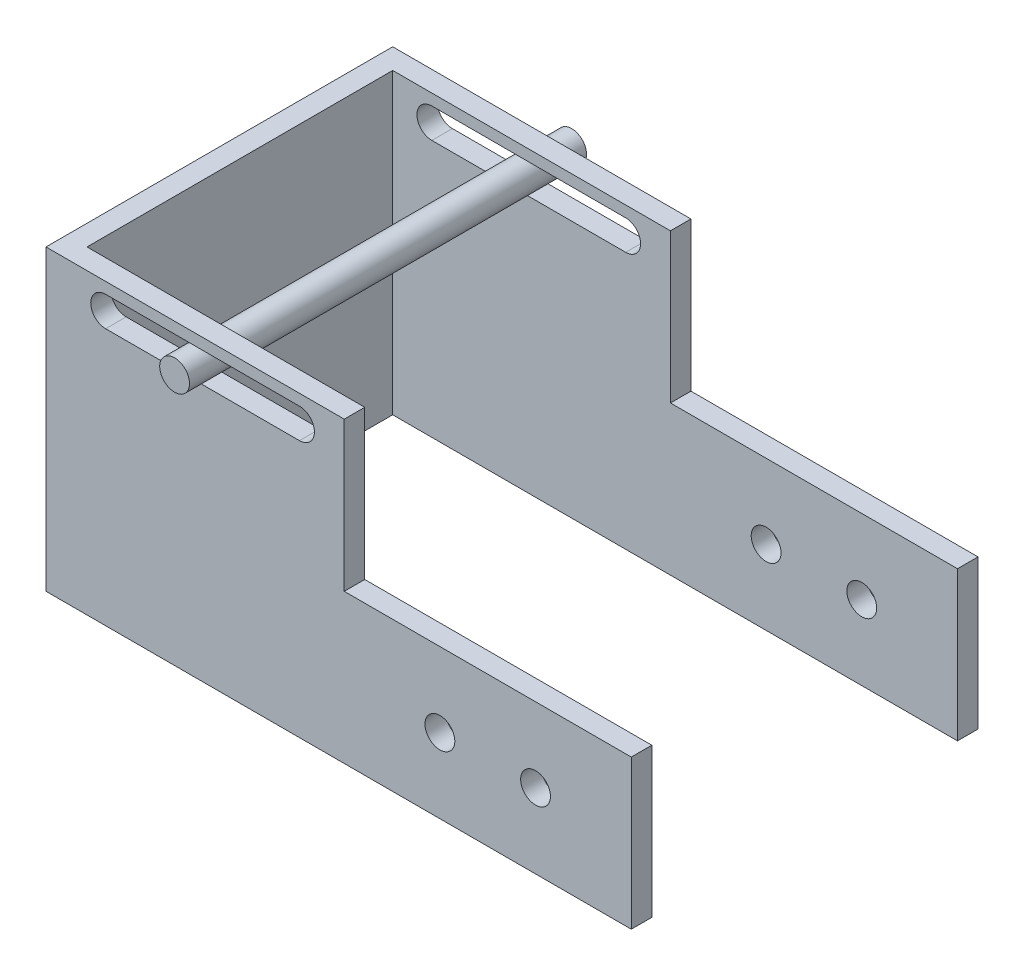
ISO-10303-21;
HEADER;
FILE_DESCRIPTION(('STEP AP214'),'2;1');
FILE_NAME('part.step','',(''),(''),'','','');
FILE_SCHEMA(('AUTOMOTIVE_DESIGN { 1 0 10303 214 1 1 1 1 }'));
ENDSEC;
DATA;
#1=APPLICATION_CONTEXT('core data for automotive mechanical design processes');
#2=APPLICATION_PROTOCOL_DEFINITION('international standard','automotive_design',2000,#1);
#3=PRODUCT_CONTEXT('',#1,'mechanical');
#4=PRODUCT('Part','Part','',(#3));
#5=PRODUCT_RELATED_PRODUCT_CATEGORY('part','',(#4));
#6=PRODUCT_DEFINITION_FORMATION('','',#4);
#7=PRODUCT_DEFINITION_CONTEXT('part definition',#1,'design');
#8=PRODUCT_DEFINITION('design','',#6,#7);
#9=PRODUCT_DEFINITION_SHAPE('','',#8);
#10=(LENGTH_UNIT() NAMED_UNIT(*) SI_UNIT(.MILLI.,.METRE.));
#11=(NAMED_UNIT(*) PLANE_ANGLE_UNIT() SI_UNIT($,.RADIAN.));
#12=(NAMED_UNIT(*) SI_UNIT($,.STERADIAN.) SOLID_ANGLE_UNIT());
#13=UNCERTAINTY_MEASURE_WITH_UNIT(LENGTH_MEASURE(1.E-05),#10,'distance_accuracy_value','');
#14=(GEOMETRIC_REPRESENTATION_CONTEXT(3) GLOBAL_UNCERTAINTY_ASSIGNED_CONTEXT((#13)) GLOBAL_UNIT_ASSIGNED_CONTEXT((#10,
#11,#12)) REPRESENTATION_CONTEXT('',''));
#15=CARTESIAN_POINT('',(0.,0.,0.));
#16=DIRECTION('',(0.,0.,1.));
#17=DIRECTION('',(1.,0.,0.));
#18=AXIS2_PLACEMENT_3D('',#15,#16,#17);
#19=CARTESIAN_POINT('',(-20.,16.5,49.25));
#20=DIRECTION('',(0.,0.,-1.));
#21=DIRECTION('',(-1.,0.,0.));
#22=AXIS2_PLACEMENT_3D('',#19,#20,#21);
#23=CYLINDRICAL_SURFACE('',#22,2.);
#24=CARTESIAN_POINT('',(-20.,16.5,49.25));
#25=DIRECTION('',(0.,0.,1.));
#26=DIRECTION('',(1.,0.,0.));
#27=AXIS2_PLACEMENT_3D('',#24,#25,#26);
#28=CIRCLE('',#27,2.);
#29=CARTESIAN_POINT('',(-18.,16.5,49.25));
#30=VERTEX_POINT('',#29);
#31=EDGE_CURVE('E11',#30,#30,#28,.T.);
#32=ORIENTED_EDGE('',*,*,#31,.F.);
#33=EDGE_LOOP('',(#32));
#34=FACE_BOUND('',#33,.T.);
#35=CARTESIAN_POINT('',(-20.,16.5,-4.));
#36=DIRECTION('',(0.,0.,1.));
#37=DIRECTION('',(1.,0.,0.));
#38=AXIS2_PLACEMENT_3D('',#35,#36,#37);
#39=CIRCLE('',#38,2.);
#40=CARTESIAN_POINT('',(-18.,16.5,-4.));
#41=VERTEX_POINT('',#40);
#42=EDGE_CURVE('E56',#41,#41,#39,.T.);
#43=ORIENTED_EDGE('',*,*,#42,.T.);
#44=EDGE_LOOP('',(#43));
#45=FACE_BOUND('',#44,.T.);
#46=ADVANCED_FACE('F53',(#34,#45),#23,.T.);
#47=CARTESIAN_POINT('',(-20.,16.5,49.25));
#48=DIRECTION('',(0.,0.,1.));
#49=DIRECTION('',(1.,0.,0.));
#50=AXIS2_PLACEMENT_3D('',#47,#48,#49);
#51=PLANE('',#50);
#52=ORIENTED_EDGE('',*,*,#31,.T.);
#53=EDGE_LOOP('',(#52));
#54=FACE_BOUND('',#53,.T.);
#55=ADVANCED_FACE('F68',(#54),#51,.T.);
#56=CARTESIAN_POINT('',(-20.,16.5,-4.));
#57=DIRECTION('',(0.,0.,1.));
#58=DIRECTION('',(1.,0.,0.));
#59=AXIS2_PLACEMENT_3D('',#56,#57,#58);
#60=PLANE('',#59);
#61=ORIENTED_EDGE('',*,*,#42,.F.);
#62=EDGE_LOOP('',(#61));
#63=FACE_BOUND('',#62,.T.);
#64=ADVANCED_FACE('F66',(#63),#60,.F.);
#65=CLOSED_SHELL('',(#46,#55,#64));
#66=MANIFOLD_SOLID_BREP('B2',#65);
#67=CARTESIAN_POINT('',(-37.25,20.,46.5));
#68=DIRECTION('',(-1.,0.,0.));
#69=DIRECTION('',(0.,-1.,0.));
#70=AXIS2_PLACEMENT_3D('',#67,#68,#69);
#71=PLANE('',#70);
#72=DIRECTION('',(0.,1.,0.));
#73=VECTOR('',#72,1.);
#74=CARTESIAN_POINT('',(-37.25,20.,43.75));
#75=LINE('',#74,#73);
#76=CARTESIAN_POINT('',(-37.25,-20.,43.75));
#77=VERTEX_POINT('',#76);
#78=CARTESIAN_POINT('',(-37.25,20.,43.75));
#79=VERTEX_POINT('',#78);
#80=EDGE_CURVE('E51',#77,#79,#75,.T.);
#81=ORIENTED_EDGE('',*,*,#80,.F.);
#82=DIRECTION('',(0.,0.,-1.));
#83=VECTOR('',#82,1.);
#84=CARTESIAN_POINT('',(-37.25,-20.,46.5));
#85=LINE('',#84,#83);
#86=CARTESIAN_POINT('',(-37.25,-20.,2.75));
#87=VERTEX_POINT('',#86);
#88=EDGE_CURVE('E118',#77,#87,#85,.T.);
#89=ORIENTED_EDGE('',*,*,#88,.T.);
#90=DIRECTION('',(0.,1.,0.));
#91=VECTOR('',#90,1.);
#92=CARTESIAN_POINT('',(-37.25,20.,2.75));
#93=LINE('',#92,#91);
#94=CARTESIAN_POINT('',(-37.25,20.,2.75));
#95=VERTEX_POINT('',#94);
#96=EDGE_CURVE('E340',#87,#95,#93,.T.);
#97=ORIENTED_EDGE('',*,*,#96,.T.);
#98=DIRECTION('',(0.,0.,-1.));
#99=VECTOR('',#98,1.);
#100=CARTESIAN_POINT('',(-37.25,20.,46.5));
#101=LINE('',#100,#99);
#102=EDGE_CURVE('E359',#79,#95,#101,.T.);
#103=ORIENTED_EDGE('',*,*,#102,.F.);
#104=EDGE_LOOP('',(#81,#89,#97,#103));
#105=FACE_BOUND('',#104,.T.);
#106=ADVANCED_FACE('F100',(#105),#71,.F.);
#107=CARTESIAN_POINT('',(0.,0.,2.75));
#108=DIRECTION('',(0.,1.,0.));
#109=DIRECTION('',(0.,0.,1.));
#110=AXIS2_PLACEMENT_3D('',#107,#108,#109);
#111=PLANE('',#110);
#112=DIRECTION('',(1.,0.,0.));
#113=VECTOR('',#112,1.);
#114=CARTESIAN_POINT('',(0.,0.,0.));
#115=LINE('',#114,#113);
#116=CARTESIAN_POINT('',(0.,0.,0.));
#117=VERTEX_POINT('',#116);
#118=CARTESIAN_POINT('',(38.5,0.,0.));
#119=VERTEX_POINT('',#118);
#120=EDGE_CURVE('E430',#117,#119,#115,.T.);
#121=ORIENTED_EDGE('',*,*,#120,.F.);
#122=DIRECTION('',(0.,0.,-1.));
#123=VECTOR('',#122,1.);
#124=CARTESIAN_POINT('',(0.,0.,2.75));
#125=LINE('',#124,#123);
#126=CARTESIAN_POINT('',(0.,0.,2.75));
#127=VERTEX_POINT('',#126);
#128=EDGE_CURVE('E109',#127,#117,#125,.T.);
#129=ORIENTED_EDGE('',*,*,#128,.F.);
#130=DIRECTION('',(1.,0.,0.));
#131=VECTOR('',#130,1.);
#132=CARTESIAN_POINT('',(0.,0.,2.75));
#133=LINE('',#132,#131);
#134=CARTESIAN_POINT('',(38.5,0.,2.75));
#135=VERTEX_POINT('',#134);
#136=EDGE_CURVE('E390',#127,#135,#133,.T.);
#137=ORIENTED_EDGE('',*,*,#136,.T.);
#138=DIRECTION('',(0.,0.,-1.));
#139=VECTOR('',#138,1.);
#140=CARTESIAN_POINT('',(38.5,0.,2.75));
#141=LINE('',#140,#139);
#142=EDGE_CURVE('E453',#135,#119,#141,.T.);
#143=ORIENTED_EDGE('',*,*,#142,.T.);
#144=EDGE_LOOP('',(#121,#129,#137,#143));
#145=FACE_BOUND('',#144,.T.);
#146=ADVANCED_FACE('F526',(#145),#111,.T.);
#147=CARTESIAN_POINT('',(0.,0.,2.75));
#148=DIRECTION('',(-1.,0.,0.));
#149=DIRECTION('',(0.,-1.,0.));
#150=AXIS2_PLACEMENT_3D('',#147,#148,#149);
#151=PLANE('',#150);
#152=DIRECTION('',(0.,1.,0.));
#153=VECTOR('',#152,1.);
#154=CARTESIAN_POINT('',(0.,0.,0.));
#155=LINE('',#154,#153);
#156=CARTESIAN_POINT('',(0.,20.,0.));
#157=VERTEX_POINT('',#156);
#158=EDGE_CURVE('E434',#117,#157,#155,.T.);
#159=ORIENTED_EDGE('',*,*,#158,.T.);
#160=DIRECTION('',(0.,0.,-1.));
#161=VECTOR('',#160,1.);
#162=CARTESIAN_POINT('',(0.,20.,2.75));
#163=LINE('',#162,#161);
#164=CARTESIAN_POINT('',(0.,20.,2.75));
#165=VERTEX_POINT('',#164);
#166=EDGE_CURVE('E467',#165,#157,#163,.T.);
#167=ORIENTED_EDGE('',*,*,#166,.F.);
#168=DIRECTION('',(0.,1.,0.));
#169=VECTOR('',#168,1.);
#170=CARTESIAN_POINT('',(0.,0.,2.75));
#171=LINE('',#170,#169);
#172=EDGE_CURVE('E394',#127,#165,#171,.T.);
#173=ORIENTED_EDGE('',*,*,#172,.F.);
#174=ORIENTED_EDGE('',*,*,#128,.T.);
#175=EDGE_LOOP('',(#159,#167,#173,#174));
#176=FACE_BOUND('',#175,.T.);
#177=ADVANCED_FACE('F548',(#176),#151,.F.);
#178=CARTESIAN_POINT('',(0.,20.,2.75));
#179=DIRECTION('',(0.,1.,0.));
#180=DIRECTION('',(0.,0.,1.));
#181=AXIS2_PLACEMENT_3D('',#178,#179,#180);
#182=PLANE('',#181);
#183=DIRECTION('',(1.,0.,0.));
#184=VECTOR('',#183,1.);
#185=CARTESIAN_POINT('',(0.,20.,43.75));
#186=LINE('',#185,#184);
#187=CARTESIAN_POINT('',(0.,20.,43.75));
#188=VERTEX_POINT('',#187);
#189=EDGE_CURVE('E322',#79,#188,#186,.T.);
#190=ORIENTED_EDGE('',*,*,#189,.F.);
#191=ORIENTED_EDGE('',*,*,#102,.T.);
#192=DIRECTION('',(1.,0.,0.));
#193=VECTOR('',#192,1.);
#194=CARTESIAN_POINT('',(0.,20.,2.75));
#195=LINE('',#194,#193);
#196=EDGE_CURVE('E398',#95,#165,#195,.T.);
#197=ORIENTED_EDGE('',*,*,#196,.T.);
#198=ORIENTED_EDGE('',*,*,#166,.T.);
#199=DIRECTION('',(1.,0.,0.));
#200=VECTOR('',#199,1.);
#201=CARTESIAN_POINT('',(0.,20.,0.));
#202=LINE('',#201,#200);
#203=CARTESIAN_POINT('',(-40.,20.,0.));
#204=VERTEX_POINT('',#203);
#205=EDGE_CURVE('E438',#204,#157,#202,.T.);
#206=ORIENTED_EDGE('',*,*,#205,.F.);
#207=DIRECTION('',(0.,0.,-1.));
#208=VECTOR('',#207,1.);
#209=CARTESIAN_POINT('',(-40.,20.,2.75));
#210=LINE('',#209,#208);
#211=CARTESIAN_POINT('',(-40.,20.,46.5));
#212=VERTEX_POINT('',#211);
#213=EDGE_CURVE('E464',#212,#204,#210,.T.);
#214=ORIENTED_EDGE('',*,*,#213,.F.);
#215=DIRECTION('',(-1.,0.,0.));
#216=VECTOR('',#215,1.);
#217=CARTESIAN_POINT('',(-40.,20.,46.5));
#218=LINE('',#217,#216);
#219=CARTESIAN_POINT('',(0.,20.,46.5));
#220=VERTEX_POINT('',#219);
#221=EDGE_CURVE('E355',#220,#212,#218,.T.);
#222=ORIENTED_EDGE('',*,*,#221,.F.);
#223=DIRECTION('',(0.,0.,-1.));
#224=VECTOR('',#223,1.);
#225=CARTESIAN_POINT('',(0.,20.,46.5));
#226=LINE('',#225,#224);
#227=EDGE_CURVE('E333',#220,#188,#226,.T.);
#228=ORIENTED_EDGE('',*,*,#227,.T.);
#229=EDGE_LOOP('',(#190,#191,#197,#198,#206,#214,#222,#228));
#230=FACE_BOUND('',#229,.T.);
#231=ADVANCED_FACE('F544',(#230),#182,.T.);
#232=CARTESIAN_POINT('',(-40.,0.,2.75));
#233=DIRECTION('',(-1.,0.,0.));
#234=DIRECTION('',(0.,0.,1.));
#235=AXIS2_PLACEMENT_3D('',#232,#233,#234);
#236=PLANE('',#235);
#237=ORIENTED_EDGE('',*,*,#213,.T.);
#238=DIRECTION('',(0.,1.,0.));
#239=VECTOR('',#238,1.);
#240=CARTESIAN_POINT('',(-40.,0.,0.));
#241=LINE('',#240,#239);
#242=CARTESIAN_POINT('',(-40.,-20.,0.));
#243=VERTEX_POINT('',#242);
#244=EDGE_CURVE('E442',#243,#204,#241,.T.);
#245=ORIENTED_EDGE('',*,*,#244,.F.);
#246=DIRECTION('',(0.,0.,-1.));
#247=VECTOR('',#246,1.);
#248=CARTESIAN_POINT('',(-40.,-20.,2.75));
#249=LINE('',#248,#247);
#250=CARTESIAN_POINT('',(-40.,-20.,46.5));
#251=VERTEX_POINT('',#250);
#252=EDGE_CURVE('E461',#251,#243,#249,.T.);
#253=ORIENTED_EDGE('',*,*,#252,.F.);
#254=DIRECTION('',(0.,-1.,0.));
#255=VECTOR('',#254,1.);
#256=CARTESIAN_POINT('',(-40.,20.,46.5));
#257=LINE('',#256,#255);
#258=EDGE_CURVE('E348',#212,#251,#257,.T.);
#259=ORIENTED_EDGE('',*,*,#258,.F.);
#260=EDGE_LOOP('',(#237,#245,#253,#259));
#261=FACE_BOUND('',#260,.T.);
#262=ADVANCED_FACE('F539',(#261),#236,.T.);
#263=CARTESIAN_POINT('',(0.,-20.,2.75));
#264=DIRECTION('',(0.,1.,0.));
#265=DIRECTION('',(0.,0.,1.));
#266=AXIS2_PLACEMENT_3D('',#263,#264,#265);
#267=PLANE('',#266);
#268=ORIENTED_EDGE('',*,*,#252,.T.);
#269=DIRECTION('',(1.,0.,0.));
#270=VECTOR('',#269,1.);
#271=CARTESIAN_POINT('',(0.,-20.,0.));
#272=LINE('',#271,#270);
#273=CARTESIAN_POINT('',(38.5,-20.,0.));
#274=VERTEX_POINT('',#273);
#275=EDGE_CURVE('E446',#243,#274,#272,.T.);
#276=ORIENTED_EDGE('',*,*,#275,.T.);
#277=DIRECTION('',(0.,0.,-1.));
#278=VECTOR('',#277,1.);
#279=CARTESIAN_POINT('',(38.5,-20.,2.75));
#280=LINE('',#279,#278);
#281=CARTESIAN_POINT('',(38.5,-20.,2.75));
#282=VERTEX_POINT('',#281);
#283=EDGE_CURVE('E456',#282,#274,#280,.T.);
#284=ORIENTED_EDGE('',*,*,#283,.F.);
#285=DIRECTION('',(1.,0.,0.));
#286=VECTOR('',#285,1.);
#287=CARTESIAN_POINT('',(0.,-20.,2.75));
#288=LINE('',#287,#286);
#289=EDGE_CURVE('E401',#87,#282,#288,.T.);
#290=ORIENTED_EDGE('',*,*,#289,.F.);
#291=ORIENTED_EDGE('',*,*,#88,.F.);
#292=DIRECTION('',(1.,0.,0.));
#293=VECTOR('',#292,1.);
#294=CARTESIAN_POINT('',(0.,-20.,43.75));
#295=LINE('',#294,#293);
#296=CARTESIAN_POINT('',(38.5,-20.,43.75));
#297=VERTEX_POINT('',#296);
#298=EDGE_CURVE('E266',#77,#297,#295,.T.);
#299=ORIENTED_EDGE('',*,*,#298,.T.);
#300=DIRECTION('',(0.,0.,-1.));
#301=VECTOR('',#300,1.);
#302=CARTESIAN_POINT('',(38.5,-20.,46.5));
#303=LINE('',#302,#301);
#304=CARTESIAN_POINT('',(38.5,-20.,46.5));
#305=VERTEX_POINT('',#304);
#306=EDGE_CURVE('E329',#305,#297,#303,.T.);
#307=ORIENTED_EDGE('',*,*,#306,.F.);
#308=DIRECTION('',(1.,0.,0.));
#309=VECTOR('',#308,1.);
#310=CARTESIAN_POINT('',(-40.,-20.,46.5));
#311=LINE('',#310,#309);
#312=EDGE_CURVE('E352',#251,#305,#311,.T.);
#313=ORIENTED_EDGE('',*,*,#312,.F.);
#314=EDGE_LOOP('',(#268,#276,#284,#290,#291,#299,#307,#313));
#315=FACE_BOUND('',#314,.T.);
#316=ADVANCED_FACE('F535',(#315),#267,.F.);
#317=CARTESIAN_POINT('',(-32.,16.5,2.75));
#318=DIRECTION('',(0.,0.,-1.));
#319=DIRECTION('',(-1.,0.,0.));
#320=AXIS2_PLACEMENT_3D('',#317,#318,#319);
#321=CYLINDRICAL_SURFACE('',#320,2.);
#322=CARTESIAN_POINT('',(-32.,16.5,0.));
#323=DIRECTION('',(0.,0.,1.));
#324=DIRECTION('',(1.,0.,0.));
#325=AXIS2_PLACEMENT_3D('',#322,#323,#324);
#326=CIRCLE('',#325,2.);
#327=CARTESIAN_POINT('',(-32.,18.5,0.));
#328=VERTEX_POINT('',#327);
#329=CARTESIAN_POINT('',(-32.,14.5,0.));
#330=VERTEX_POINT('',#329);
#331=EDGE_CURVE('E366',#328,#330,#326,.T.);
#332=ORIENTED_EDGE('',*,*,#331,.F.);
#333=DIRECTION('',(0.,0.,-1.));
#334=VECTOR('',#333,1.);
#335=CARTESIAN_POINT('',(-32.,18.5,2.75));
#336=LINE('',#335,#334);
#337=CARTESIAN_POINT('',(-32.,18.5,2.75));
#338=VERTEX_POINT('',#337);
#339=EDGE_CURVE('E457',#338,#328,#336,.T.);
#340=ORIENTED_EDGE('',*,*,#339,.F.);
#341=CARTESIAN_POINT('',(-32.,16.5,2.75));
#342=DIRECTION('',(0.,0.,1.));
#343=DIRECTION('',(1.,0.,0.));
#344=AXIS2_PLACEMENT_3D('',#341,#342,#343);
#345=CIRCLE('',#344,2.);
#346=CARTESIAN_POINT('',(-32.,14.5,2.75));
#347=VERTEX_POINT('',#346);
#348=EDGE_CURVE('E367',#338,#347,#345,.T.);
#349=ORIENTED_EDGE('',*,*,#348,.T.);
#350=DIRECTION('',(0.,0.,-1.));
#351=VECTOR('',#350,1.);
#352=CARTESIAN_POINT('',(-32.,14.5,2.75));
#353=LINE('',#352,#351);
#354=EDGE_CURVE('E407',#347,#330,#353,.T.);
#355=ORIENTED_EDGE('',*,*,#354,.T.);
#356=EDGE_LOOP('',(#332,#340,#349,#355));
#357=FACE_BOUND('',#356,.T.);
#358=ADVANCED_FACE('F102',(#357),#321,.F.);
#359=CARTESIAN_POINT('',(0.,18.5,2.75));
#360=DIRECTION('',(0.,1.,0.));
#361=DIRECTION('',(0.,0.,1.));
#362=AXIS2_PLACEMENT_3D('',#359,#360,#361);
#363=PLANE('',#362);
#364=DIRECTION('',(1.,0.,0.));
#365=VECTOR('',#364,1.);
#366=CARTESIAN_POINT('',(0.,18.5,0.));
#367=LINE('',#366,#365);
#368=CARTESIAN_POINT('',(-6.,18.5,0.));
#369=VERTEX_POINT('',#368);
#370=EDGE_CURVE('E411',#328,#369,#367,.T.);
#371=ORIENTED_EDGE('',*,*,#370,.T.);
#372=DIRECTION('',(0.,0.,-1.));
#373=VECTOR('',#372,1.);
#374=CARTESIAN_POINT('',(-6.,18.5,2.75));
#375=LINE('',#374,#373);
#376=CARTESIAN_POINT('',(-6.,18.5,2.75));
#377=VERTEX_POINT('',#376);
#378=EDGE_CURVE('E477',#377,#369,#375,.T.);
#379=ORIENTED_EDGE('',*,*,#378,.F.);
#380=DIRECTION('',(1.,0.,0.));
#381=VECTOR('',#380,1.);
#382=CARTESIAN_POINT('',(0.,18.5,2.75));
#383=LINE('',#382,#381);
#384=EDGE_CURVE('E371',#338,#377,#383,.T.);
#385=ORIENTED_EDGE('',*,*,#384,.F.);
#386=ORIENTED_EDGE('',*,*,#339,.T.);
#387=EDGE_LOOP('',(#371,#379,#385,#386));
#388=FACE_BOUND('',#387,.T.);
#389=ADVANCED_FACE('F484',(#388),#363,.F.);
#390=CARTESIAN_POINT('',(-6.,16.5,2.75));
#391=DIRECTION('',(0.,0.,-1.));
#392=DIRECTION('',(-1.,0.,0.));
#393=AXIS2_PLACEMENT_3D('',#390,#391,#392);
#394=CYLINDRICAL_SURFACE('',#393,2.);
#395=CARTESIAN_POINT('',(-6.,16.5,0.));
#396=DIRECTION('',(0.,0.,1.));
#397=DIRECTION('',(1.,0.,0.));
#398=AXIS2_PLACEMENT_3D('',#395,#396,#397);
#399=CIRCLE('',#398,2.);
#400=CARTESIAN_POINT('',(-6.,14.5,0.));
#401=VERTEX_POINT('',#400);
#402=EDGE_CURVE('E414',#369,#401,#399,.F.);
#403=ORIENTED_EDGE('',*,*,#402,.T.);
#404=DIRECTION('',(0.,0.,-1.));
#405=VECTOR('',#404,1.);
#406=CARTESIAN_POINT('',(-6.,14.5,2.75));
#407=LINE('',#406,#405);
#408=CARTESIAN_POINT('',(-6.,14.5,2.75));
#409=VERTEX_POINT('',#408);
#410=EDGE_CURVE('E474',#409,#401,#407,.T.);
#411=ORIENTED_EDGE('',*,*,#410,.F.);
#412=CARTESIAN_POINT('',(-6.,16.5,2.75));
#413=DIRECTION('',(0.,0.,1.));
#414=DIRECTION('',(1.,0.,0.));
#415=AXIS2_PLACEMENT_3D('',#412,#413,#414);
#416=CIRCLE('',#415,2.);
#417=EDGE_CURVE('E375',#377,#409,#416,.F.);
#418=ORIENTED_EDGE('',*,*,#417,.F.);
#419=ORIENTED_EDGE('',*,*,#378,.T.);
#420=EDGE_LOOP('',(#403,#411,#418,#419));
#421=FACE_BOUND('',#420,.T.);
#422=ADVANCED_FACE('F500',(#421),#394,.F.);
#423=CARTESIAN_POINT('',(12.83,-10.,2.75));
#424=DIRECTION('',(0.,0.,-1.));
#425=DIRECTION('',(-1.,0.,0.));
#426=AXIS2_PLACEMENT_3D('',#423,#424,#425);
#427=CYLINDRICAL_SURFACE('',#426,2.);
#428=CARTESIAN_POINT('',(12.83,-10.,2.75));
#429=DIRECTION('',(0.,0.,1.));
#430=DIRECTION('',(1.,0.,0.));
#431=AXIS2_PLACEMENT_3D('',#428,#429,#430);
#432=CIRCLE('',#431,2.);
#433=CARTESIAN_POINT('',(14.83,-10.,2.75));
#434=VERTEX_POINT('',#433);
#435=EDGE_CURVE('E386',#434,#434,#432,.T.);
#436=ORIENTED_EDGE('',*,*,#435,.T.);
#437=EDGE_LOOP('',(#436));
#438=FACE_BOUND('',#437,.T.);
#439=CARTESIAN_POINT('',(12.83,-10.,0.));
#440=DIRECTION('',(0.,0.,1.));
#441=DIRECTION('',(1.,0.,0.));
#442=AXIS2_PLACEMENT_3D('',#439,#440,#441);
#443=CIRCLE('',#442,2.);
#444=CARTESIAN_POINT('',(14.83,-10.,0.));
#445=VERTEX_POINT('',#444);
#446=EDGE_CURVE('E426',#445,#445,#443,.T.);
#447=ORIENTED_EDGE('',*,*,#446,.F.);
#448=EDGE_LOOP('',(#447));
#449=FACE_BOUND('',#448,.T.);
#450=ADVANCED_FACE('F512',(#438,#449),#427,.F.);
#451=CARTESIAN_POINT('',(25.66,-10.,2.75));
#452=DIRECTION('',(0.,0.,-1.));
#453=DIRECTION('',(-1.,0.,0.));
#454=AXIS2_PLACEMENT_3D('',#451,#452,#453);
#455=CYLINDRICAL_SURFACE('',#454,2.);
#456=CARTESIAN_POINT('',(25.66,-10.,2.75));
#457=DIRECTION('',(0.,0.,1.));
#458=DIRECTION('',(1.,0.,0.));
#459=AXIS2_PLACEMENT_3D('',#456,#457,#458);
#460=CIRCLE('',#459,2.);
#461=CARTESIAN_POINT('',(27.66,-10.,2.75));
#462=VERTEX_POINT('',#461);
#463=EDGE_CURVE('E382',#462,#462,#460,.T.);
#464=ORIENTED_EDGE('',*,*,#463,.T.);
#465=EDGE_LOOP('',(#464));
#466=FACE_BOUND('',#465,.T.);
#467=CARTESIAN_POINT('',(25.66,-10.,0.));
#468=DIRECTION('',(0.,0.,1.));
#469=DIRECTION('',(1.,0.,0.));
#470=AXIS2_PLACEMENT_3D('',#467,#468,#469);
#471=CIRCLE('',#470,2.);
#472=CARTESIAN_POINT('',(27.66,-10.,0.));
#473=VERTEX_POINT('',#472);
#474=EDGE_CURVE('E422',#473,#473,#471,.T.);
#475=ORIENTED_EDGE('',*,*,#474,.F.);
#476=EDGE_LOOP('',(#475));
#477=FACE_BOUND('',#476,.T.);
#478=ADVANCED_FACE('F515',(#466,#477),#455,.F.);
#479=CARTESIAN_POINT('',(0.,14.5,2.75));
#480=DIRECTION('',(0.,1.,0.));
#481=DIRECTION('',(-1.,0.,0.));
#482=AXIS2_PLACEMENT_3D('',#479,#480,#481);
#483=PLANE('',#482);
#484=DIRECTION('',(1.,0.,0.));
#485=VECTOR('',#484,1.);
#486=CARTESIAN_POINT('',(0.,14.5,0.));
#487=LINE('',#486,#485);
#488=EDGE_CURVE('E418',#330,#401,#487,.T.);
#489=ORIENTED_EDGE('',*,*,#488,.F.);
#490=ORIENTED_EDGE('',*,*,#354,.F.);
#491=DIRECTION('',(1.,0.,0.));
#492=VECTOR('',#491,1.);
#493=CARTESIAN_POINT('',(0.,14.5,2.75));
#494=LINE('',#493,#492);
#495=EDGE_CURVE('E378',#347,#409,#494,.T.);
#496=ORIENTED_EDGE('',*,*,#495,.T.);
#497=ORIENTED_EDGE('',*,*,#410,.T.);
#498=EDGE_LOOP('',(#489,#490,#496,#497));
#499=FACE_BOUND('',#498,.T.);
#500=ADVANCED_FACE('F496',(#499),#483,.T.);
#501=CARTESIAN_POINT('',(38.5,0.,2.75));
#502=DIRECTION('',(-1.,0.,0.));
#503=DIRECTION('',(0.,-1.,0.));
#504=AXIS2_PLACEMENT_3D('',#501,#502,#503);
#505=PLANE('',#504);
#506=DIRECTION('',(0.,1.,0.));
#507=VECTOR('',#506,1.);
#508=CARTESIAN_POINT('',(38.5,0.,0.));
#509=LINE('',#508,#507);
#510=EDGE_CURVE('E372',#274,#119,#509,.T.);
#511=ORIENTED_EDGE('',*,*,#510,.T.);
#512=ORIENTED_EDGE('',*,*,#142,.F.);
#513=DIRECTION('',(0.,1.,0.));
#514=VECTOR('',#513,1.);
#515=CARTESIAN_POINT('',(38.5,0.,2.75));
#516=LINE('',#515,#514);
#517=EDGE_CURVE('E404',#282,#135,#516,.T.);
#518=ORIENTED_EDGE('',*,*,#517,.F.);
#519=ORIENTED_EDGE('',*,*,#283,.T.);
#520=EDGE_LOOP('',(#511,#512,#518,#519));
#521=FACE_BOUND('',#520,.T.);
#522=ADVANCED_FACE('F505',(#521),#505,.F.);
#523=CARTESIAN_POINT('',(0.,0.,2.75));
#524=DIRECTION('',(0.,0.,1.));
#525=DIRECTION('',(1.,0.,0.));
#526=AXIS2_PLACEMENT_3D('',#523,#524,#525);
#527=PLANE('',#526);
#528=ORIENTED_EDGE('',*,*,#96,.F.);
#529=ORIENTED_EDGE('',*,*,#289,.T.);
#530=ORIENTED_EDGE('',*,*,#517,.T.);
#531=ORIENTED_EDGE('',*,*,#136,.F.);
#532=ORIENTED_EDGE('',*,*,#172,.T.);
#533=ORIENTED_EDGE('',*,*,#196,.F.);
#534=EDGE_LOOP('',(#528,#529,#530,#531,#532,#533));
#535=FACE_BOUND('',#534,.T.);
#536=ORIENTED_EDGE('',*,*,#348,.F.);
#537=ORIENTED_EDGE('',*,*,#384,.T.);
#538=ORIENTED_EDGE('',*,*,#417,.T.);
#539=ORIENTED_EDGE('',*,*,#495,.F.);
#540=EDGE_LOOP('',(#536,#537,#538,#539));
#541=FACE_BOUND('',#540,.T.);
#542=ORIENTED_EDGE('',*,*,#463,.F.);
#543=EDGE_LOOP('',(#542));
#544=FACE_BOUND('',#543,.T.);
#545=ORIENTED_EDGE('',*,*,#435,.F.);
#546=EDGE_LOOP('',(#545));
#547=FACE_BOUND('',#546,.T.);
#548=ADVANCED_FACE('F502',(#535,#541,#544,#547),#527,.T.);
#549=CARTESIAN_POINT('',(0.,0.,0.));
#550=DIRECTION('',(0.,0.,1.));
#551=DIRECTION('',(1.,0.,0.));
#552=AXIS2_PLACEMENT_3D('',#549,#550,#551);
#553=PLANE('',#552);
#554=ORIENTED_EDGE('',*,*,#331,.T.);
#555=ORIENTED_EDGE('',*,*,#488,.T.);
#556=ORIENTED_EDGE('',*,*,#402,.F.);
#557=ORIENTED_EDGE('',*,*,#370,.F.);
#558=EDGE_LOOP('',(#554,#555,#556,#557));
#559=FACE_BOUND('',#558,.T.);
#560=ORIENTED_EDGE('',*,*,#474,.T.);
#561=EDGE_LOOP('',(#560));
#562=FACE_BOUND('',#561,.T.);
#563=ORIENTED_EDGE('',*,*,#446,.T.);
#564=EDGE_LOOP('',(#563));
#565=FACE_BOUND('',#564,.T.);
#566=ORIENTED_EDGE('',*,*,#120,.T.);
#567=ORIENTED_EDGE('',*,*,#510,.F.);
#568=ORIENTED_EDGE('',*,*,#275,.F.);
#569=ORIENTED_EDGE('',*,*,#244,.T.);
#570=ORIENTED_EDGE('',*,*,#205,.T.);
#571=ORIENTED_EDGE('',*,*,#158,.F.);
#572=EDGE_LOOP('',(#566,#567,#568,#569,#570,#571));
#573=FACE_BOUND('',#572,.T.);
#574=ADVANCED_FACE('F491',(#559,#562,#565,#573),#553,.F.);
#575=CARTESIAN_POINT('',(0.,0.,46.5));
#576=DIRECTION('',(0.,0.,1.));
#577=DIRECTION('',(1.,0.,0.));
#578=AXIS2_PLACEMENT_3D('',#575,#576,#577);
#579=PLANE('',#578);
#580=ORIENTED_EDGE('',*,*,#258,.T.);
#581=ORIENTED_EDGE('',*,*,#312,.T.);
#582=DIRECTION('',(0.,1.,0.));
#583=VECTOR('',#582,1.);
#584=CARTESIAN_POINT('',(38.5,0.,46.5));
#585=LINE('',#584,#583);
#586=CARTESIAN_POINT('',(38.5,0.,46.5));
#587=VERTEX_POINT('',#586);
#588=EDGE_CURVE('E289',#305,#587,#585,.T.);
#589=ORIENTED_EDGE('',*,*,#588,.T.);
#590=DIRECTION('',(1.,0.,0.));
#591=VECTOR('',#590,1.);
#592=CARTESIAN_POINT('',(0.,0.,46.5));
#593=LINE('',#592,#591);
#594=CARTESIAN_POINT('',(0.,0.,46.5));
#595=VERTEX_POINT('',#594);
#596=EDGE_CURVE('E281',#595,#587,#593,.T.);
#597=ORIENTED_EDGE('',*,*,#596,.F.);
#598=DIRECTION('',(0.,1.,0.));
#599=VECTOR('',#598,1.);
#600=CARTESIAN_POINT('',(0.,0.,46.5));
#601=LINE('',#600,#599);
#602=EDGE_CURVE('E285',#595,#220,#601,.T.);
#603=ORIENTED_EDGE('',*,*,#602,.T.);
#604=ORIENTED_EDGE('',*,*,#221,.T.);
#605=EDGE_LOOP('',(#580,#581,#589,#597,#603,#604));
#606=FACE_BOUND('',#605,.T.);
#607=CARTESIAN_POINT('',(12.83,-10.,46.5));
#608=DIRECTION('',(0.,0.,1.));
#609=DIRECTION('',(1.,0.,0.));
#610=AXIS2_PLACEMENT_3D('',#607,#608,#609);
#611=CIRCLE('',#610,2.);
#612=CARTESIAN_POINT('',(14.83,-10.,46.5));
#613=VERTEX_POINT('',#612);
#614=EDGE_CURVE('E277',#613,#613,#611,.T.);
#615=ORIENTED_EDGE('',*,*,#614,.F.);
#616=EDGE_LOOP('',(#615));
#617=FACE_BOUND('',#616,.T.);
#618=CARTESIAN_POINT('',(25.66,-10.,46.5));
#619=DIRECTION('',(0.,0.,1.));
#620=DIRECTION('',(1.,0.,0.));
#621=AXIS2_PLACEMENT_3D('',#618,#619,#620);
#622=CIRCLE('',#621,2.);
#623=CARTESIAN_POINT('',(27.66,-10.,46.5));
#624=VERTEX_POINT('',#623);
#625=EDGE_CURVE('E273',#624,#624,#622,.T.);
#626=ORIENTED_EDGE('',*,*,#625,.F.);
#627=EDGE_LOOP('',(#626));
#628=FACE_BOUND('',#627,.T.);
#629=CARTESIAN_POINT('',(-32.,16.5,46.5));
#630=DIRECTION('',(0.,0.,1.));
#631=DIRECTION('',(1.,0.,0.));
#632=AXIS2_PLACEMENT_3D('',#629,#630,#631);
#633=CIRCLE('',#632,2.);
#634=CARTESIAN_POINT('',(-32.,18.5,46.5));
#635=VERTEX_POINT('',#634);
#636=CARTESIAN_POINT('',(-32.,14.5,46.5));
#637=VERTEX_POINT('',#636);
#638=EDGE_CURVE('E239',#635,#637,#633,.T.);
#639=ORIENTED_EDGE('',*,*,#638,.F.);
#640=DIRECTION('',(1.,0.,0.));
#641=VECTOR('',#640,1.);
#642=CARTESIAN_POINT('',(0.,18.5,46.5));
#643=LINE('',#642,#641);
#644=CARTESIAN_POINT('',(-6.,18.5,46.5));
#645=VERTEX_POINT('',#644);
#646=EDGE_CURVE('E250',#635,#645,#643,.T.);
#647=ORIENTED_EDGE('',*,*,#646,.T.);
#648=CARTESIAN_POINT('',(-6.,16.5,46.5));
#649=DIRECTION('',(0.,0.,1.));
#650=DIRECTION('',(1.,0.,0.));
#651=AXIS2_PLACEMENT_3D('',#648,#649,#650);
#652=CIRCLE('',#651,2.);
#653=CARTESIAN_POINT('',(-6.,14.5,46.5));
#654=VERTEX_POINT('',#653);
#655=EDGE_CURVE('E256',#645,#654,#652,.F.);
#656=ORIENTED_EDGE('',*,*,#655,.T.);
#657=DIRECTION('',(1.,0.,0.));
#658=VECTOR('',#657,1.);
#659=CARTESIAN_POINT('',(0.,14.5,46.5));
#660=LINE('',#659,#658);
#661=EDGE_CURVE('E260',#637,#654,#660,.T.);
#662=ORIENTED_EDGE('',*,*,#661,.F.);
#663=EDGE_LOOP('',(#639,#647,#656,#662));
#664=FACE_BOUND('',#663,.T.);
#665=ADVANCED_FACE('F258',(#606,#617,#628,#664),#579,.T.);
#666=CARTESIAN_POINT('',(0.,0.,43.75));
#667=DIRECTION('',(0.,0.,1.));
#668=DIRECTION('',(1.,0.,0.));
#669=AXIS2_PLACEMENT_3D('',#666,#667,#668);
#670=PLANE('',#669);
#671=CARTESIAN_POINT('',(-32.,16.5,43.75));
#672=DIRECTION('',(0.,0.,1.));
#673=DIRECTION('',(1.,0.,0.));
#674=AXIS2_PLACEMENT_3D('',#671,#672,#673);
#675=CIRCLE('',#674,2.);
#676=CARTESIAN_POINT('',(-32.,18.5,43.75));
#677=VERTEX_POINT('',#676);
#678=CARTESIAN_POINT('',(-32.,14.5,43.75));
#679=VERTEX_POINT('',#678);
#680=EDGE_CURVE('E242',#677,#679,#675,.T.);
#681=ORIENTED_EDGE('',*,*,#680,.T.);
#682=DIRECTION('',(1.,0.,0.));
#683=VECTOR('',#682,1.);
#684=CARTESIAN_POINT('',(0.,14.5,43.75));
#685=LINE('',#684,#683);
#686=CARTESIAN_POINT('',(-6.,14.5,43.75));
#687=VERTEX_POINT('',#686);
#688=EDGE_CURVE('E302',#679,#687,#685,.T.);
#689=ORIENTED_EDGE('',*,*,#688,.T.);
#690=CARTESIAN_POINT('',(-6.,16.5,43.75));
#691=DIRECTION('',(0.,0.,1.));
#692=DIRECTION('',(1.,0.,0.));
#693=AXIS2_PLACEMENT_3D('',#690,#691,#692);
#694=CIRCLE('',#693,2.);
#695=CARTESIAN_POINT('',(-6.,18.5,43.75));
#696=VERTEX_POINT('',#695);
#697=EDGE_CURVE('E298',#696,#687,#694,.F.);
#698=ORIENTED_EDGE('',*,*,#697,.F.);
#699=DIRECTION('',(1.,0.,0.));
#700=VECTOR('',#699,1.);
#701=CARTESIAN_POINT('',(0.,18.5,43.75));
#702=LINE('',#701,#700);
#703=EDGE_CURVE('E295',#677,#696,#702,.T.);
#704=ORIENTED_EDGE('',*,*,#703,.F.);
#705=EDGE_LOOP('',(#681,#689,#698,#704));
#706=FACE_BOUND('',#705,.T.);
#707=CARTESIAN_POINT('',(25.66,-10.,43.75));
#708=DIRECTION('',(0.,0.,1.));
#709=DIRECTION('',(1.,0.,0.));
#710=AXIS2_PLACEMENT_3D('',#707,#708,#709);
#711=CIRCLE('',#710,2.);
#712=CARTESIAN_POINT('',(27.66,-10.,43.75));
#713=VERTEX_POINT('',#712);
#714=EDGE_CURVE('E306',#713,#713,#711,.T.);
#715=ORIENTED_EDGE('',*,*,#714,.T.);
#716=EDGE_LOOP('',(#715));
#717=FACE_BOUND('',#716,.T.);
#718=CARTESIAN_POINT('',(12.83,-10.,43.75));
#719=DIRECTION('',(0.,0.,1.));
#720=DIRECTION('',(1.,0.,0.));
#721=AXIS2_PLACEMENT_3D('',#718,#719,#720);
#722=CIRCLE('',#721,2.);
#723=CARTESIAN_POINT('',(14.83,-10.,43.75));
#724=VERTEX_POINT('',#723);
#725=EDGE_CURVE('E310',#724,#724,#722,.T.);
#726=ORIENTED_EDGE('',*,*,#725,.T.);
#727=EDGE_LOOP('',(#726));
#728=FACE_BOUND('',#727,.T.);
#729=ORIENTED_EDGE('',*,*,#298,.F.);
#730=ORIENTED_EDGE('',*,*,#80,.T.);
#731=ORIENTED_EDGE('',*,*,#189,.T.);
#732=DIRECTION('',(0.,1.,0.));
#733=VECTOR('',#732,1.);
#734=CARTESIAN_POINT('',(0.,0.,43.75));
#735=LINE('',#734,#733);
#736=CARTESIAN_POINT('',(0.,0.,43.75));
#737=VERTEX_POINT('',#736);
#738=EDGE_CURVE('E318',#737,#188,#735,.T.);
#739=ORIENTED_EDGE('',*,*,#738,.F.);
#740=DIRECTION('',(1.,0.,0.));
#741=VECTOR('',#740,1.);
#742=CARTESIAN_POINT('',(0.,0.,43.75));
#743=LINE('',#742,#741);
#744=CARTESIAN_POINT('',(38.5,0.,43.75));
#745=VERTEX_POINT('',#744);
#746=EDGE_CURVE('E314',#737,#745,#743,.T.);
#747=ORIENTED_EDGE('',*,*,#746,.T.);
#748=DIRECTION('',(0.,1.,0.));
#749=VECTOR('',#748,1.);
#750=CARTESIAN_POINT('',(38.5,0.,43.75));
#751=LINE('',#750,#749);
#752=EDGE_CURVE('E262',#297,#745,#751,.T.);
#753=ORIENTED_EDGE('',*,*,#752,.F.);
#754=EDGE_LOOP('',(#729,#730,#731,#739,#747,#753));
#755=FACE_BOUND('',#754,.T.);
#756=ADVANCED_FACE('F553',(#706,#717,#728,#755),#670,.F.);
#757=CARTESIAN_POINT('',(0.,0.,46.5));
#758=DIRECTION('',(0.,1.,0.));
#759=DIRECTION('',(0.,0.,1.));
#760=AXIS2_PLACEMENT_3D('',#757,#758,#759);
#761=PLANE('',#760);
#762=ORIENTED_EDGE('',*,*,#746,.F.);
#763=DIRECTION('',(0.,0.,-1.));
#764=VECTOR('',#763,1.);
#765=CARTESIAN_POINT('',(0.,0.,46.5));
#766=LINE('',#765,#764);
#767=EDGE_CURVE('E337',#595,#737,#766,.T.);
#768=ORIENTED_EDGE('',*,*,#767,.F.);
#769=ORIENTED_EDGE('',*,*,#596,.T.);
#770=DIRECTION('',(0.,0.,-1.));
#771=VECTOR('',#770,1.);
#772=CARTESIAN_POINT('',(38.5,0.,46.5));
#773=LINE('',#772,#771);
#774=EDGE_CURVE('E246',#587,#745,#773,.T.);
#775=ORIENTED_EDGE('',*,*,#774,.T.);
#776=EDGE_LOOP('',(#762,#768,#769,#775));
#777=FACE_BOUND('',#776,.T.);
#778=ADVANCED_FACE('F568',(#777),#761,.T.);
#779=CARTESIAN_POINT('',(0.,0.,46.5));
#780=DIRECTION('',(-1.,0.,0.));
#781=DIRECTION('',(0.,-1.,0.));
#782=AXIS2_PLACEMENT_3D('',#779,#780,#781);
#783=PLANE('',#782);
#784=ORIENTED_EDGE('',*,*,#738,.T.);
#785=ORIENTED_EDGE('',*,*,#227,.F.);
#786=ORIENTED_EDGE('',*,*,#602,.F.);
#787=ORIENTED_EDGE('',*,*,#767,.T.);
#788=EDGE_LOOP('',(#784,#785,#786,#787));
#789=FACE_BOUND('',#788,.T.);
#790=ADVANCED_FACE('F566',(#789),#783,.F.);
#791=CARTESIAN_POINT('',(-32.,16.5,46.5));
#792=DIRECTION('',(0.,0.,-1.));
#793=DIRECTION('',(-1.,0.,0.));
#794=AXIS2_PLACEMENT_3D('',#791,#792,#793);
#795=CYLINDRICAL_SURFACE('',#794,2.);
#796=ORIENTED_EDGE('',*,*,#680,.F.);
#797=DIRECTION('',(0.,0.,-1.));
#798=VECTOR('',#797,1.);
#799=CARTESIAN_POINT('',(-32.,18.5,46.5));
#800=LINE('',#799,#798);
#801=EDGE_CURVE('E235',#635,#677,#800,.T.);
#802=ORIENTED_EDGE('',*,*,#801,.F.);
#803=ORIENTED_EDGE('',*,*,#638,.T.);
#804=DIRECTION('',(0.,0.,-1.));
#805=VECTOR('',#804,1.);
#806=CARTESIAN_POINT('',(-32.,14.5,46.5));
#807=LINE('',#806,#805);
#808=EDGE_CURVE('E292',#637,#679,#807,.T.);
#809=ORIENTED_EDGE('',*,*,#808,.T.);
#810=EDGE_LOOP('',(#796,#802,#803,#809));
#811=FACE_BOUND('',#810,.T.);
#812=ADVANCED_FACE('F237',(#811),#795,.F.);
#813=CARTESIAN_POINT('',(0.,18.5,46.5));
#814=DIRECTION('',(0.,1.,0.));
#815=DIRECTION('',(0.,0.,1.));
#816=AXIS2_PLACEMENT_3D('',#813,#814,#815);
#817=PLANE('',#816);
#818=ORIENTED_EDGE('',*,*,#703,.T.);
#819=DIRECTION('',(0.,0.,-1.));
#820=VECTOR('',#819,1.);
#821=CARTESIAN_POINT('',(-6.,18.5,46.5));
#822=LINE('',#821,#820);
#823=EDGE_CURVE('E247',#645,#696,#822,.T.);
#824=ORIENTED_EDGE('',*,*,#823,.F.);
#825=ORIENTED_EDGE('',*,*,#646,.F.);
#826=ORIENTED_EDGE('',*,*,#801,.T.);
#827=EDGE_LOOP('',(#818,#824,#825,#826));
#828=FACE_BOUND('',#827,.T.);
#829=ADVANCED_FACE('F251',(#828),#817,.F.);
#830=CARTESIAN_POINT('',(-6.,16.5,46.5));
#831=DIRECTION('',(0.,0.,-1.));
#832=DIRECTION('',(-1.,0.,0.));
#833=AXIS2_PLACEMENT_3D('',#830,#831,#832);
#834=CYLINDRICAL_SURFACE('',#833,2.);
#835=ORIENTED_EDGE('',*,*,#697,.T.);
#836=DIRECTION('',(0.,0.,-1.));
#837=VECTOR('',#836,1.);
#838=CARTESIAN_POINT('',(-6.,14.5,46.5));
#839=LINE('',#838,#837);
#840=EDGE_CURVE('E343',#654,#687,#839,.T.);
#841=ORIENTED_EDGE('',*,*,#840,.F.);
#842=ORIENTED_EDGE('',*,*,#655,.F.);
#843=ORIENTED_EDGE('',*,*,#823,.T.);
#844=EDGE_LOOP('',(#835,#841,#842,#843));
#845=FACE_BOUND('',#844,.T.);
#846=ADVANCED_FACE('F763',(#845),#834,.F.);
#847=CARTESIAN_POINT('',(12.83,-10.,46.5));
#848=DIRECTION('',(0.,0.,-1.));
#849=DIRECTION('',(-1.,0.,0.));
#850=AXIS2_PLACEMENT_3D('',#847,#848,#849);
#851=CYLINDRICAL_SURFACE('',#850,2.);
#852=ORIENTED_EDGE('',*,*,#614,.T.);
#853=EDGE_LOOP('',(#852));
#854=FACE_BOUND('',#853,.T.);
#855=ORIENTED_EDGE('',*,*,#725,.F.);
#856=EDGE_LOOP('',(#855));
#857=FACE_BOUND('',#856,.T.);
#858=ADVANCED_FACE('F773',(#854,#857),#851,.F.);
#859=CARTESIAN_POINT('',(25.66,-10.,46.5));
#860=DIRECTION('',(0.,0.,-1.));
#861=DIRECTION('',(-1.,0.,0.));
#862=AXIS2_PLACEMENT_3D('',#859,#860,#861);
#863=CYLINDRICAL_SURFACE('',#862,2.);
#864=ORIENTED_EDGE('',*,*,#625,.T.);
#865=EDGE_LOOP('',(#864));
#866=FACE_BOUND('',#865,.T.);
#867=ORIENTED_EDGE('',*,*,#714,.F.);
#868=EDGE_LOOP('',(#867));
#869=FACE_BOUND('',#868,.T.);
#870=ADVANCED_FACE('F784',(#866,#869),#863,.F.);
#871=CARTESIAN_POINT('',(0.,14.5,46.5));
#872=DIRECTION('',(0.,1.,0.));
#873=DIRECTION('',(-1.,0.,0.));
#874=AXIS2_PLACEMENT_3D('',#871,#872,#873);
#875=PLANE('',#874);
#876=ORIENTED_EDGE('',*,*,#688,.F.);
#877=ORIENTED_EDGE('',*,*,#808,.F.);
#878=ORIENTED_EDGE('',*,*,#661,.T.);
#879=ORIENTED_EDGE('',*,*,#840,.T.);
#880=EDGE_LOOP('',(#876,#877,#878,#879));
#881=FACE_BOUND('',#880,.T.);
#882=ADVANCED_FACE('F794',(#881),#875,.T.);
#883=CARTESIAN_POINT('',(38.5,0.,46.5));
#884=DIRECTION('',(-1.,0.,0.));
#885=DIRECTION('',(0.,-1.,0.));
#886=AXIS2_PLACEMENT_3D('',#883,#884,#885);
#887=PLANE('',#886);
#888=ORIENTED_EDGE('',*,*,#752,.T.);
#889=ORIENTED_EDGE('',*,*,#774,.F.);
#890=ORIENTED_EDGE('',*,*,#588,.F.);
#891=ORIENTED_EDGE('',*,*,#306,.T.);
#892=EDGE_LOOP('',(#888,#889,#890,#891));
#893=FACE_BOUND('',#892,.T.);
#894=ADVANCED_FACE('F559',(#893),#887,.F.);
#895=CLOSED_SHELL('',(#106,#146,#177,#231,#262,#316,#358,#389,#422,#450,#478,#500,#522,#548,
#574,#665,#756,#778,#790,#812,#829,#846,#858,#870,#882,#894));
#896=MANIFOLD_SOLID_BREP('B6',#895);
#897=ADVANCED_BREP_SHAPE_REPRESENTATION('',(#18,#66,#896),#14);
#898=SHAPE_DEFINITION_REPRESENTATION(#9,#897);
ENDSEC;
END-ISO-10303-21;
